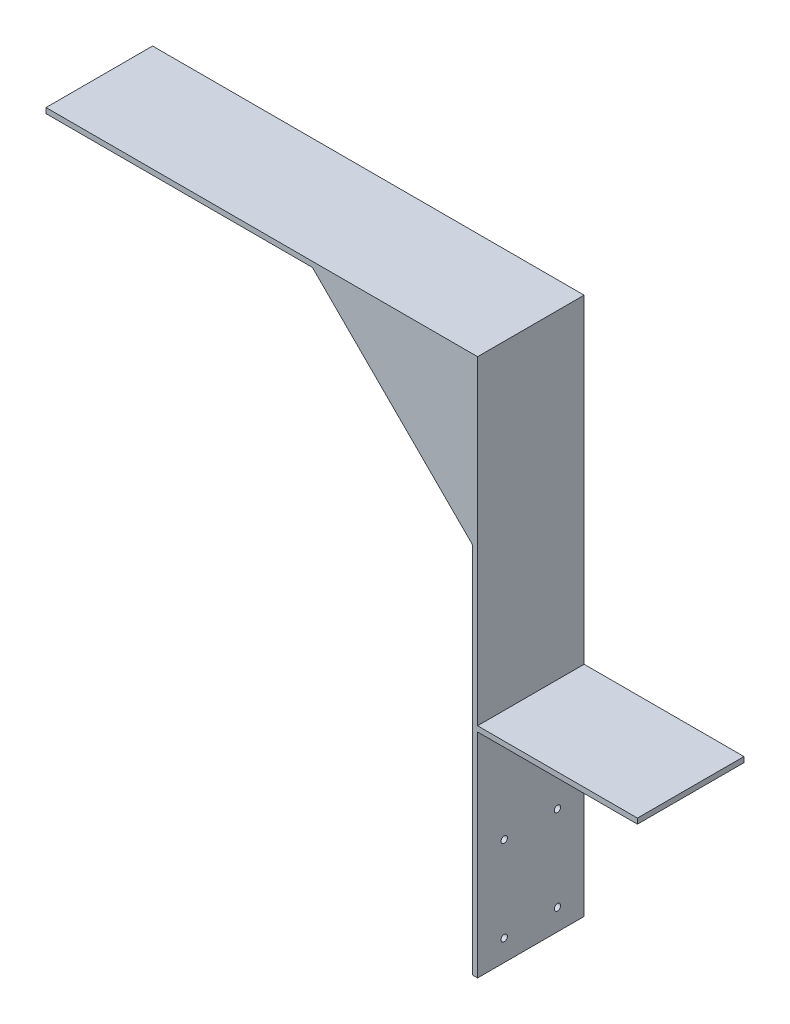
ISO-10303-21;
HEADER;
FILE_DESCRIPTION(('STEP AP214'),'2;1');
FILE_NAME('part.step','',(''),(''),'','','');
FILE_SCHEMA(('AUTOMOTIVE_DESIGN { 1 0 10303 214 1 1 1 1 }'));
ENDSEC;
DATA;
#1=APPLICATION_CONTEXT('core data for automotive mechanical design processes');
#2=APPLICATION_PROTOCOL_DEFINITION('international standard','automotive_design',2000,#1);
#3=PRODUCT_CONTEXT('',#1,'mechanical');
#4=PRODUCT('Part','Part','',(#3));
#5=PRODUCT_RELATED_PRODUCT_CATEGORY('part','',(#4));
#6=PRODUCT_DEFINITION_FORMATION('','',#4);
#7=PRODUCT_DEFINITION_CONTEXT('part definition',#1,'design');
#8=PRODUCT_DEFINITION('design','',#6,#7);
#9=PRODUCT_DEFINITION_SHAPE('','',#8);
#10=(LENGTH_UNIT() NAMED_UNIT(*) SI_UNIT(.MILLI.,.METRE.));
#11=(NAMED_UNIT(*) PLANE_ANGLE_UNIT() SI_UNIT($,.RADIAN.));
#12=(NAMED_UNIT(*) SI_UNIT($,.STERADIAN.) SOLID_ANGLE_UNIT());
#13=UNCERTAINTY_MEASURE_WITH_UNIT(LENGTH_MEASURE(1.E-05),#10,'distance_accuracy_value','');
#14=(GEOMETRIC_REPRESENTATION_CONTEXT(3) GLOBAL_UNCERTAINTY_ASSIGNED_CONTEXT((#13)) GLOBAL_UNIT_ASSIGNED_CONTEXT((#10,
#11,#12)) REPRESENTATION_CONTEXT('',''));
#15=CARTESIAN_POINT('',(0.,0.,0.));
#16=DIRECTION('',(0.,0.,1.));
#17=DIRECTION('',(1.,0.,0.));
#18=AXIS2_PLACEMENT_3D('',#15,#16,#17);
#19=CARTESIAN_POINT('',(5.,0.,100.));
#20=DIRECTION('',(-1.,0.,0.));
#21=DIRECTION('',(0.,0.,1.));
#22=AXIS2_PLACEMENT_3D('',#19,#20,#21);
#23=PLANE('',#22);
#24=DIRECTION('',(0.,0.,1.));
#25=VECTOR('',#24,1.);
#26=CARTESIAN_POINT('',(5.,205.,100.));
#27=LINE('',#26,#25);
#28=CARTESIAN_POINT('',(5.,205.,0.));
#29=VERTEX_POINT('',#28);
#30=CARTESIAN_POINT('',(5.,205.,100.));
#31=VERTEX_POINT('',#30);
#32=EDGE_CURVE('E143',#29,#31,#27,.T.);
#33=ORIENTED_EDGE('',*,*,#32,.F.);
#34=DIRECTION('',(0.,1.,0.));
#35=VECTOR('',#34,1.);
#36=CARTESIAN_POINT('',(5.,0.,0.));
#37=LINE('',#36,#35);
#38=CARTESIAN_POINT('',(5.,505.,0.));
#39=VERTEX_POINT('',#38);
#40=EDGE_CURVE('E211',#29,#39,#37,.T.);
#41=ORIENTED_EDGE('',*,*,#40,.T.);
#42=DIRECTION('',(0.,0.,-1.));
#43=VECTOR('',#42,1.);
#44=CARTESIAN_POINT('',(5.,505.,100.));
#45=LINE('',#44,#43);
#46=CARTESIAN_POINT('',(5.,505.,100.));
#47=VERTEX_POINT('',#46);
#48=EDGE_CURVE('E196',#47,#39,#45,.T.);
#49=ORIENTED_EDGE('',*,*,#48,.F.);
#50=DIRECTION('',(0.,1.,0.));
#51=VECTOR('',#50,1.);
#52=CARTESIAN_POINT('',(5.,0.,100.));
#53=LINE('',#52,#51);
#54=EDGE_CURVE('E194',#31,#47,#53,.T.);
#55=ORIENTED_EDGE('',*,*,#54,.F.);
#56=EDGE_LOOP('',(#33,#41,#49,#55));
#57=FACE_BOUND('',#56,.T.);
#58=ADVANCED_FACE('F34',(#57),#23,.F.);
#59=CARTESIAN_POINT('',(5.,20.,25.));
#60=DIRECTION('',(1.,0.,0.));
#61=DIRECTION('',(0.,0.,-1.));
#62=AXIS2_PLACEMENT_3D('',#59,#60,#61);
#63=CIRCLE('',#62,2.99999999999999);
#64=CARTESIAN_POINT('',(5.,20.,22.));
#65=VERTEX_POINT('',#64);
#66=EDGE_CURVE('E174',#65,#65,#63,.T.);
#67=ORIENTED_EDGE('',*,*,#66,.F.);
#68=EDGE_LOOP('',(#67));
#69=FACE_BOUND('',#68,.T.);
#70=CARTESIAN_POINT('',(5.,20.,75.));
#71=DIRECTION('',(1.,0.,0.));
#72=DIRECTION('',(0.,0.,-1.));
#73=AXIS2_PLACEMENT_3D('',#70,#71,#72);
#74=CIRCLE('',#73,2.99999999999999);
#75=CARTESIAN_POINT('',(5.,20.,72.));
#76=VERTEX_POINT('',#75);
#77=EDGE_CURVE('E168',#76,#76,#74,.T.);
#78=ORIENTED_EDGE('',*,*,#77,.F.);
#79=EDGE_LOOP('',(#78));
#80=FACE_BOUND('',#79,.T.);
#81=CARTESIAN_POINT('',(5.,100.,75.));
#82=DIRECTION('',(1.,0.,0.));
#83=DIRECTION('',(0.,0.,-1.));
#84=AXIS2_PLACEMENT_3D('',#81,#82,#83);
#85=CIRCLE('',#84,2.99999999999999);
#86=CARTESIAN_POINT('',(5.,100.,72.));
#87=VERTEX_POINT('',#86);
#88=EDGE_CURVE('E162',#87,#87,#85,.T.);
#89=ORIENTED_EDGE('',*,*,#88,.F.);
#90=EDGE_LOOP('',(#89));
#91=FACE_BOUND('',#90,.T.);
#92=CARTESIAN_POINT('',(5.,100.,25.));
#93=DIRECTION('',(1.,0.,0.));
#94=DIRECTION('',(0.,0.,-1.));
#95=AXIS2_PLACEMENT_3D('',#92,#93,#94);
#96=CIRCLE('',#95,2.99999999999999);
#97=CARTESIAN_POINT('',(5.,100.,22.));
#98=VERTEX_POINT('',#97);
#99=EDGE_CURVE('E151',#98,#98,#96,.T.);
#100=ORIENTED_EDGE('',*,*,#99,.F.);
#101=EDGE_LOOP('',(#100));
#102=FACE_BOUND('',#101,.T.);
#103=DIRECTION('',(0.,0.,-1.));
#104=VECTOR('',#103,1.);
#105=CARTESIAN_POINT('',(5.,200.,100.));
#106=LINE('',#105,#104);
#107=CARTESIAN_POINT('',(5.,200.,100.));
#108=VERTEX_POINT('',#107);
#109=CARTESIAN_POINT('',(5.,200.,0.));
#110=VERTEX_POINT('',#109);
#111=EDGE_CURVE('E252',#108,#110,#106,.T.);
#112=ORIENTED_EDGE('',*,*,#111,.F.);
#113=CARTESIAN_POINT('',(5.,0.,100.));
#114=VERTEX_POINT('',#113);
#115=EDGE_CURVE('E150',#114,#108,#53,.T.);
#116=ORIENTED_EDGE('',*,*,#115,.F.);
#117=DIRECTION('',(0.,0.,-1.));
#118=VECTOR('',#117,1.);
#119=CARTESIAN_POINT('',(5.,0.,100.));
#120=LINE('',#119,#118);
#121=CARTESIAN_POINT('',(5.,0.,0.));
#122=VERTEX_POINT('',#121);
#123=EDGE_CURVE('E215',#114,#122,#120,.T.);
#124=ORIENTED_EDGE('',*,*,#123,.T.);
#125=EDGE_CURVE('E184',#122,#110,#37,.T.);
#126=ORIENTED_EDGE('',*,*,#125,.T.);
#127=EDGE_LOOP('',(#112,#116,#124,#126));
#128=FACE_BOUND('',#127,.T.);
#129=ADVANCED_FACE('F281',(#69,#80,#91,#102,#128),#23,.F.);
#130=CARTESIAN_POINT('',(0.,505.,100.));
#131=DIRECTION('',(0.,-1.,0.));
#132=DIRECTION('',(1.,0.,0.));
#133=AXIS2_PLACEMENT_3D('',#130,#131,#132);
#134=PLANE('',#133);
#135=DIRECTION('',(-1.,0.,0.));
#136=VECTOR('',#135,1.);
#137=CARTESIAN_POINT('',(0.,505.,0.));
#138=LINE('',#137,#136);
#139=CARTESIAN_POINT('',(-400.,504.999999999999,0.));
#140=VERTEX_POINT('',#139);
#141=EDGE_CURVE('E180',#39,#140,#138,.T.);
#142=ORIENTED_EDGE('',*,*,#141,.T.);
#143=DIRECTION('',(0.,0.,-1.));
#144=VECTOR('',#143,1.);
#145=CARTESIAN_POINT('',(-400.,504.999999999999,100.));
#146=LINE('',#145,#144);
#147=CARTESIAN_POINT('',(-400.,504.999999999999,100.));
#148=VERTEX_POINT('',#147);
#149=EDGE_CURVE('E11',#148,#140,#146,.T.);
#150=ORIENTED_EDGE('',*,*,#149,.F.);
#151=DIRECTION('',(-1.,0.,0.));
#152=VECTOR('',#151,1.);
#153=CARTESIAN_POINT('',(0.,505.,100.));
#154=LINE('',#153,#152);
#155=EDGE_CURVE('E181',#47,#148,#154,.T.);
#156=ORIENTED_EDGE('',*,*,#155,.F.);
#157=ORIENTED_EDGE('',*,*,#48,.T.);
#158=EDGE_LOOP('',(#142,#150,#156,#157));
#159=FACE_BOUND('',#158,.T.);
#160=ADVANCED_FACE('F36',(#159),#134,.F.);
#161=CARTESIAN_POINT('',(-400.,499.999999999999,100.));
#162=DIRECTION('',(-1.,0.,0.));
#163=DIRECTION('',(0.,0.,1.));
#164=AXIS2_PLACEMENT_3D('',#161,#162,#163);
#165=PLANE('',#164);
#166=DIRECTION('',(0.,1.,0.));
#167=VECTOR('',#166,1.);
#168=CARTESIAN_POINT('',(-400.,499.999999999999,0.));
#169=LINE('',#168,#167);
#170=CARTESIAN_POINT('',(-400.,499.999999999999,0.));
#171=VERTEX_POINT('',#170);
#172=EDGE_CURVE('E199',#171,#140,#169,.T.);
#173=ORIENTED_EDGE('',*,*,#172,.F.);
#174=DIRECTION('',(0.,0.,-1.));
#175=VECTOR('',#174,1.);
#176=CARTESIAN_POINT('',(-400.,499.999999999999,100.));
#177=LINE('',#176,#175);
#178=CARTESIAN_POINT('',(-400.,499.999999999999,100.));
#179=VERTEX_POINT('',#178);
#180=EDGE_CURVE('E42',#179,#171,#177,.T.);
#181=ORIENTED_EDGE('',*,*,#180,.F.);
#182=DIRECTION('',(0.,1.,0.));
#183=VECTOR('',#182,1.);
#184=CARTESIAN_POINT('',(-400.,499.999999999999,100.));
#185=LINE('',#184,#183);
#186=EDGE_CURVE('E183',#179,#148,#185,.T.);
#187=ORIENTED_EDGE('',*,*,#186,.T.);
#188=ORIENTED_EDGE('',*,*,#149,.T.);
#189=EDGE_LOOP('',(#173,#181,#187,#188));
#190=FACE_BOUND('',#189,.T.);
#191=ADVANCED_FACE('F226',(#190),#165,.T.);
#192=CARTESIAN_POINT('',(0.,500.,100.));
#193=DIRECTION('',(0.,-1.,0.));
#194=DIRECTION('',(1.,0.,0.));
#195=AXIS2_PLACEMENT_3D('',#192,#193,#194);
#196=PLANE('',#195);
#197=DIRECTION('',(0.,0.,1.));
#198=VECTOR('',#197,1.);
#199=CARTESIAN_POINT('',(-150.,500.,95.));
#200=LINE('',#199,#198);
#201=CARTESIAN_POINT('',(-150.,499.999999999999,95.));
#202=VERTEX_POINT('',#201);
#203=CARTESIAN_POINT('',(-150.,499.999999999999,100.));
#204=VERTEX_POINT('',#203);
#205=EDGE_CURVE('E249',#202,#204,#200,.T.);
#206=ORIENTED_EDGE('',*,*,#205,.T.);
#207=DIRECTION('',(-1.,0.,0.));
#208=VECTOR('',#207,1.);
#209=CARTESIAN_POINT('',(0.,500.,100.));
#210=LINE('',#209,#208);
#211=EDGE_CURVE('E187',#204,#179,#210,.T.);
#212=ORIENTED_EDGE('',*,*,#211,.T.);
#213=ORIENTED_EDGE('',*,*,#180,.T.);
#214=DIRECTION('',(-1.,0.,0.));
#215=VECTOR('',#214,1.);
#216=CARTESIAN_POINT('',(0.,500.,0.));
#217=LINE('',#216,#215);
#218=CARTESIAN_POINT('',(0.,500.,0.));
#219=VERTEX_POINT('',#218);
#220=EDGE_CURVE('E202',#219,#171,#217,.T.);
#221=ORIENTED_EDGE('',*,*,#220,.F.);
#222=DIRECTION('',(0.,0.,-1.));
#223=VECTOR('',#222,1.);
#224=CARTESIAN_POINT('',(0.,500.,100.));
#225=LINE('',#224,#223);
#226=CARTESIAN_POINT('',(0.,500.,95.));
#227=VERTEX_POINT('',#226);
#228=EDGE_CURVE('E219',#227,#219,#225,.T.);
#229=ORIENTED_EDGE('',*,*,#228,.F.);
#230=DIRECTION('',(-1.,0.,0.));
#231=VECTOR('',#230,1.);
#232=CARTESIAN_POINT('',(0.,500.,95.));
#233=LINE('',#232,#231);
#234=EDGE_CURVE('E49',#227,#202,#233,.T.);
#235=ORIENTED_EDGE('',*,*,#234,.T.);
#236=EDGE_LOOP('',(#206,#212,#213,#221,#229,#235));
#237=FACE_BOUND('',#236,.T.);
#238=ADVANCED_FACE('F223',(#237),#196,.T.);
#239=CARTESIAN_POINT('',(0.,0.,100.));
#240=DIRECTION('',(-1.,0.,0.));
#241=DIRECTION('',(0.,0.,1.));
#242=AXIS2_PLACEMENT_3D('',#239,#240,#241);
#243=PLANE('',#242);
#244=DIRECTION('',(0.,0.,1.));
#245=VECTOR('',#244,1.);
#246=CARTESIAN_POINT('',(0.,350.,95.));
#247=LINE('',#246,#245);
#248=CARTESIAN_POINT('',(0.,350.,95.));
#249=VERTEX_POINT('',#248);
#250=CARTESIAN_POINT('',(0.,350.,100.));
#251=VERTEX_POINT('',#250);
#252=EDGE_CURVE('E57',#249,#251,#247,.T.);
#253=ORIENTED_EDGE('',*,*,#252,.F.);
#254=DIRECTION('',(0.,1.,0.));
#255=VECTOR('',#254,1.);
#256=CARTESIAN_POINT('',(0.,350.,95.));
#257=LINE('',#256,#255);
#258=EDGE_CURVE('E238',#249,#227,#257,.T.);
#259=ORIENTED_EDGE('',*,*,#258,.T.);
#260=ORIENTED_EDGE('',*,*,#228,.T.);
#261=DIRECTION('',(0.,1.,0.));
#262=VECTOR('',#261,1.);
#263=CARTESIAN_POINT('',(0.,0.,0.));
#264=LINE('',#263,#262);
#265=CARTESIAN_POINT('',(0.,0.,0.));
#266=VERTEX_POINT('',#265);
#267=EDGE_CURVE('E205',#266,#219,#264,.T.);
#268=ORIENTED_EDGE('',*,*,#267,.F.);
#269=DIRECTION('',(0.,0.,-1.));
#270=VECTOR('',#269,1.);
#271=CARTESIAN_POINT('',(0.,0.,100.));
#272=LINE('',#271,#270);
#273=CARTESIAN_POINT('',(0.,0.,100.));
#274=VERTEX_POINT('',#273);
#275=EDGE_CURVE('E217',#274,#266,#272,.T.);
#276=ORIENTED_EDGE('',*,*,#275,.F.);
#277=DIRECTION('',(0.,1.,0.));
#278=VECTOR('',#277,1.);
#279=CARTESIAN_POINT('',(0.,0.,100.));
#280=LINE('',#279,#278);
#281=EDGE_CURVE('E189',#274,#251,#280,.T.);
#282=ORIENTED_EDGE('',*,*,#281,.T.);
#283=EDGE_LOOP('',(#253,#259,#260,#268,#276,#282));
#284=FACE_BOUND('',#283,.T.);
#285=CARTESIAN_POINT('',(0.,100.,25.));
#286=DIRECTION('',(-1.,0.,0.));
#287=DIRECTION('',(0.,0.,1.));
#288=AXIS2_PLACEMENT_3D('',#285,#286,#287);
#289=CIRCLE('',#288,2.99999999999995);
#290=CARTESIAN_POINT('',(0.,100.,28.));
#291=VERTEX_POINT('',#290);
#292=EDGE_CURVE('E154',#291,#291,#289,.T.);
#293=ORIENTED_EDGE('',*,*,#292,.F.);
#294=EDGE_LOOP('',(#293));
#295=FACE_BOUND('',#294,.T.);
#296=CARTESIAN_POINT('',(0.,100.,75.));
#297=DIRECTION('',(-1.,0.,0.));
#298=DIRECTION('',(0.,0.,1.));
#299=AXIS2_PLACEMENT_3D('',#296,#297,#298);
#300=CIRCLE('',#299,2.99999999999995);
#301=CARTESIAN_POINT('',(0.,100.,78.));
#302=VERTEX_POINT('',#301);
#303=EDGE_CURVE('E165',#302,#302,#300,.T.);
#304=ORIENTED_EDGE('',*,*,#303,.F.);
#305=EDGE_LOOP('',(#304));
#306=FACE_BOUND('',#305,.T.);
#307=CARTESIAN_POINT('',(0.,20.,75.));
#308=DIRECTION('',(-1.,0.,0.));
#309=DIRECTION('',(0.,0.,1.));
#310=AXIS2_PLACEMENT_3D('',#307,#308,#309);
#311=CIRCLE('',#310,2.99999999999995);
#312=CARTESIAN_POINT('',(0.,20.,78.));
#313=VERTEX_POINT('',#312);
#314=EDGE_CURVE('E171',#313,#313,#311,.T.);
#315=ORIENTED_EDGE('',*,*,#314,.F.);
#316=EDGE_LOOP('',(#315));
#317=FACE_BOUND('',#316,.T.);
#318=CARTESIAN_POINT('',(0.,20.,25.));
#319=DIRECTION('',(-1.,0.,0.));
#320=DIRECTION('',(0.,0.,1.));
#321=AXIS2_PLACEMENT_3D('',#318,#319,#320);
#322=CIRCLE('',#321,2.99999999999995);
#323=CARTESIAN_POINT('',(0.,20.,28.));
#324=VERTEX_POINT('',#323);
#325=EDGE_CURVE('E177',#324,#324,#322,.T.);
#326=ORIENTED_EDGE('',*,*,#325,.F.);
#327=EDGE_LOOP('',(#326));
#328=FACE_BOUND('',#327,.T.);
#329=ADVANCED_FACE('F234',(#284,#295,#306,#317,#328),#243,.T.);
#330=CARTESIAN_POINT('',(5.,0.,100.));
#331=DIRECTION('',(0.,-1.,0.));
#332=DIRECTION('',(0.,0.,-1.));
#333=AXIS2_PLACEMENT_3D('',#330,#331,#332);
#334=PLANE('',#333);
#335=DIRECTION('',(-1.,0.,0.));
#336=VECTOR('',#335,1.);
#337=CARTESIAN_POINT('',(5.,0.,0.));
#338=LINE('',#337,#336);
#339=EDGE_CURVE('E208',#122,#266,#338,.T.);
#340=ORIENTED_EDGE('',*,*,#339,.F.);
#341=ORIENTED_EDGE('',*,*,#123,.F.);
#342=DIRECTION('',(-1.,0.,0.));
#343=VECTOR('',#342,1.);
#344=CARTESIAN_POINT('',(5.,0.,100.));
#345=LINE('',#344,#343);
#346=EDGE_CURVE('E191',#114,#274,#345,.T.);
#347=ORIENTED_EDGE('',*,*,#346,.T.);
#348=ORIENTED_EDGE('',*,*,#275,.T.);
#349=EDGE_LOOP('',(#340,#341,#347,#348));
#350=FACE_BOUND('',#349,.T.);
#351=ADVANCED_FACE('F290',(#350),#334,.T.);
#352=CARTESIAN_POINT('',(0.,0.,100.));
#353=DIRECTION('',(0.,0.,-1.));
#354=DIRECTION('',(-1.,0.,0.));
#355=AXIS2_PLACEMENT_3D('',#352,#353,#354);
#356=PLANE('',#355);
#357=ORIENTED_EDGE('',*,*,#211,.F.);
#358=DIRECTION('',(0.707106781186547,-0.707106781186548,0.));
#359=VECTOR('',#358,1.);
#360=CARTESIAN_POINT('',(-150.,500.,100.));
#361=LINE('',#360,#359);
#362=EDGE_CURVE('E243',#204,#251,#361,.T.);
#363=ORIENTED_EDGE('',*,*,#362,.T.);
#364=ORIENTED_EDGE('',*,*,#281,.F.);
#365=ORIENTED_EDGE('',*,*,#346,.F.);
#366=ORIENTED_EDGE('',*,*,#115,.T.);
#367=DIRECTION('',(-1.,0.,0.));
#368=VECTOR('',#367,1.);
#369=CARTESIAN_POINT('',(155.,200.,100.));
#370=LINE('',#369,#368);
#371=CARTESIAN_POINT('',(155.,200.,100.));
#372=VERTEX_POINT('',#371);
#373=EDGE_CURVE('E128',#372,#108,#370,.T.);
#374=ORIENTED_EDGE('',*,*,#373,.F.);
#375=DIRECTION('',(0.,-1.,0.));
#376=VECTOR('',#375,1.);
#377=CARTESIAN_POINT('',(155.,205.,100.));
#378=LINE('',#377,#376);
#379=CARTESIAN_POINT('',(155.,205.,100.));
#380=VERTEX_POINT('',#379);
#381=EDGE_CURVE('E134',#380,#372,#378,.T.);
#382=ORIENTED_EDGE('',*,*,#381,.F.);
#383=DIRECTION('',(-1.,0.,0.));
#384=VECTOR('',#383,1.);
#385=CARTESIAN_POINT('',(155.,205.,100.));
#386=LINE('',#385,#384);
#387=EDGE_CURVE('E256',#380,#31,#386,.T.);
#388=ORIENTED_EDGE('',*,*,#387,.T.);
#389=ORIENTED_EDGE('',*,*,#54,.T.);
#390=ORIENTED_EDGE('',*,*,#155,.T.);
#391=ORIENTED_EDGE('',*,*,#186,.F.);
#392=EDGE_LOOP('',(#357,#363,#364,#365,#366,#374,#382,#388,#389,#390,#391));
#393=FACE_BOUND('',#392,.T.);
#394=ADVANCED_FACE('F147',(#393),#356,.F.);
#395=CARTESIAN_POINT('',(0.,0.,0.));
#396=DIRECTION('',(0.,0.,-1.));
#397=DIRECTION('',(-1.,0.,0.));
#398=AXIS2_PLACEMENT_3D('',#395,#396,#397);
#399=PLANE('',#398);
#400=ORIENTED_EDGE('',*,*,#141,.F.);
#401=ORIENTED_EDGE('',*,*,#40,.F.);
#402=DIRECTION('',(-1.,0.,0.));
#403=VECTOR('',#402,1.);
#404=CARTESIAN_POINT('',(155.,205.,0.));
#405=LINE('',#404,#403);
#406=CARTESIAN_POINT('',(155.,205.,0.));
#407=VERTEX_POINT('',#406);
#408=EDGE_CURVE('E156',#407,#29,#405,.T.);
#409=ORIENTED_EDGE('',*,*,#408,.F.);
#410=DIRECTION('',(0.,1.,0.));
#411=VECTOR('',#410,1.);
#412=CARTESIAN_POINT('',(155.,205.,0.));
#413=LINE('',#412,#411);
#414=CARTESIAN_POINT('',(155.,200.,0.));
#415=VERTEX_POINT('',#414);
#416=EDGE_CURVE('E133',#415,#407,#413,.T.);
#417=ORIENTED_EDGE('',*,*,#416,.F.);
#418=DIRECTION('',(-1.,0.,0.));
#419=VECTOR('',#418,1.);
#420=CARTESIAN_POINT('',(155.,200.,0.));
#421=LINE('',#420,#419);
#422=EDGE_CURVE('E130',#415,#110,#421,.T.);
#423=ORIENTED_EDGE('',*,*,#422,.T.);
#424=ORIENTED_EDGE('',*,*,#125,.F.);
#425=ORIENTED_EDGE('',*,*,#339,.T.);
#426=ORIENTED_EDGE('',*,*,#267,.T.);
#427=ORIENTED_EDGE('',*,*,#220,.T.);
#428=ORIENTED_EDGE('',*,*,#172,.T.);
#429=EDGE_LOOP('',(#400,#401,#409,#417,#423,#424,#425,#426,#427,#428));
#430=FACE_BOUND('',#429,.T.);
#431=ADVANCED_FACE('F230',(#430),#399,.T.);
#432=CARTESIAN_POINT('',(5.,20.,25.));
#433=DIRECTION('',(1.,0.,0.));
#434=DIRECTION('',(0.,0.,-1.));
#435=AXIS2_PLACEMENT_3D('',#432,#433,#434);
#436=CYLINDRICAL_SURFACE('',#435,2.99999999999995);
#437=ORIENTED_EDGE('',*,*,#325,.T.);
#438=EDGE_LOOP('',(#437));
#439=FACE_BOUND('',#438,.T.);
#440=ORIENTED_EDGE('',*,*,#66,.T.);
#441=EDGE_LOOP('',(#440));
#442=FACE_BOUND('',#441,.T.);
#443=ADVANCED_FACE('F320',(#439,#442),#436,.F.);
#444=CARTESIAN_POINT('',(5.,20.,75.));
#445=DIRECTION('',(1.,0.,0.));
#446=DIRECTION('',(0.,0.,-1.));
#447=AXIS2_PLACEMENT_3D('',#444,#445,#446);
#448=CYLINDRICAL_SURFACE('',#447,2.99999999999995);
#449=ORIENTED_EDGE('',*,*,#314,.T.);
#450=EDGE_LOOP('',(#449));
#451=FACE_BOUND('',#450,.T.);
#452=ORIENTED_EDGE('',*,*,#77,.T.);
#453=EDGE_LOOP('',(#452));
#454=FACE_BOUND('',#453,.T.);
#455=ADVANCED_FACE('F392',(#451,#454),#448,.F.);
#456=CARTESIAN_POINT('',(5.,100.,75.));
#457=DIRECTION('',(1.,0.,0.));
#458=DIRECTION('',(0.,0.,-1.));
#459=AXIS2_PLACEMENT_3D('',#456,#457,#458);
#460=CYLINDRICAL_SURFACE('',#459,2.99999999999995);
#461=ORIENTED_EDGE('',*,*,#303,.T.);
#462=EDGE_LOOP('',(#461));
#463=FACE_BOUND('',#462,.T.);
#464=ORIENTED_EDGE('',*,*,#88,.T.);
#465=EDGE_LOOP('',(#464));
#466=FACE_BOUND('',#465,.T.);
#467=ADVANCED_FACE('F402',(#463,#466),#460,.F.);
#468=CARTESIAN_POINT('',(5.,100.,25.));
#469=DIRECTION('',(1.,0.,0.));
#470=DIRECTION('',(0.,0.,-1.));
#471=AXIS2_PLACEMENT_3D('',#468,#469,#470);
#472=CYLINDRICAL_SURFACE('',#471,2.99999999999995);
#473=ORIENTED_EDGE('',*,*,#292,.T.);
#474=EDGE_LOOP('',(#473));
#475=FACE_BOUND('',#474,.T.);
#476=ORIENTED_EDGE('',*,*,#99,.T.);
#477=EDGE_LOOP('',(#476));
#478=FACE_BOUND('',#477,.T.);
#479=ADVANCED_FACE('F332',(#475,#478),#472,.F.);
#480=CARTESIAN_POINT('',(155.,200.,100.));
#481=DIRECTION('',(0.,1.,0.));
#482=DIRECTION('',(0.,0.,1.));
#483=AXIS2_PLACEMENT_3D('',#480,#481,#482);
#484=PLANE('',#483);
#485=ORIENTED_EDGE('',*,*,#111,.T.);
#486=ORIENTED_EDGE('',*,*,#422,.F.);
#487=DIRECTION('',(0.,0.,-1.));
#488=VECTOR('',#487,1.);
#489=CARTESIAN_POINT('',(155.,200.,100.));
#490=LINE('',#489,#488);
#491=EDGE_CURVE('E123',#372,#415,#490,.T.);
#492=ORIENTED_EDGE('',*,*,#491,.F.);
#493=ORIENTED_EDGE('',*,*,#373,.T.);
#494=EDGE_LOOP('',(#485,#486,#492,#493));
#495=FACE_BOUND('',#494,.T.);
#496=ADVANCED_FACE('F126',(#495),#484,.F.);
#497=CARTESIAN_POINT('',(155.,205.,100.));
#498=DIRECTION('',(0.,-1.,0.));
#499=DIRECTION('',(0.,0.,-1.));
#500=AXIS2_PLACEMENT_3D('',#497,#498,#499);
#501=PLANE('',#500);
#502=ORIENTED_EDGE('',*,*,#32,.T.);
#503=ORIENTED_EDGE('',*,*,#387,.F.);
#504=DIRECTION('',(0.,0.,1.));
#505=VECTOR('',#504,1.);
#506=CARTESIAN_POINT('',(155.,205.,100.));
#507=LINE('',#506,#505);
#508=EDGE_CURVE('E139',#407,#380,#507,.T.);
#509=ORIENTED_EDGE('',*,*,#508,.F.);
#510=ORIENTED_EDGE('',*,*,#408,.T.);
#511=EDGE_LOOP('',(#502,#503,#509,#510));
#512=FACE_BOUND('',#511,.T.);
#513=ADVANCED_FACE('F263',(#512),#501,.F.);
#514=CARTESIAN_POINT('',(155.,0.,0.));
#515=DIRECTION('',(1.,0.,0.));
#516=DIRECTION('',(0.,0.,-1.));
#517=AXIS2_PLACEMENT_3D('',#514,#515,#516);
#518=PLANE('',#517);
#519=ORIENTED_EDGE('',*,*,#381,.T.);
#520=ORIENTED_EDGE('',*,*,#491,.T.);
#521=ORIENTED_EDGE('',*,*,#416,.T.);
#522=ORIENTED_EDGE('',*,*,#508,.T.);
#523=EDGE_LOOP('',(#519,#520,#521,#522));
#524=FACE_BOUND('',#523,.T.);
#525=ADVANCED_FACE('F137',(#524),#518,.T.);
#526=CARTESIAN_POINT('',(-150.,500.,95.));
#527=DIRECTION('',(-0.707106781186548,-0.707106781186547,0.));
#528=DIRECTION('',(0.707106781186547,-0.707106781186548,0.));
#529=AXIS2_PLACEMENT_3D('',#526,#527,#528);
#530=PLANE('',#529);
#531=ORIENTED_EDGE('',*,*,#362,.F.);
#532=ORIENTED_EDGE('',*,*,#205,.F.);
#533=DIRECTION('',(0.707106781186547,-0.707106781186548,0.));
#534=VECTOR('',#533,1.);
#535=CARTESIAN_POINT('',(-150.,500.,95.));
#536=LINE('',#535,#534);
#537=EDGE_CURVE('E242',#202,#249,#536,.T.);
#538=ORIENTED_EDGE('',*,*,#537,.T.);
#539=ORIENTED_EDGE('',*,*,#252,.T.);
#540=EDGE_LOOP('',(#531,#532,#538,#539));
#541=FACE_BOUND('',#540,.T.);
#542=ADVANCED_FACE('F271',(#541),#530,.T.);
#543=CARTESIAN_POINT('',(0.,0.,95.));
#544=DIRECTION('',(0.,0.,-1.));
#545=DIRECTION('',(-1.,0.,0.));
#546=AXIS2_PLACEMENT_3D('',#543,#544,#545);
#547=PLANE('',#546);
#548=ORIENTED_EDGE('',*,*,#234,.F.);
#549=ORIENTED_EDGE('',*,*,#258,.F.);
#550=ORIENTED_EDGE('',*,*,#537,.F.);
#551=EDGE_LOOP('',(#548,#549,#550));
#552=FACE_BOUND('',#551,.T.);
#553=ADVANCED_FACE('F241',(#552),#547,.T.);
#554=CLOSED_SHELL('',(#58,#129,#160,#191,#238,#329,#351,#394,#431,#443,#455,#467,#479,#496,#513,
#525,#542,#553));
#555=MANIFOLD_SOLID_BREP('B2',#554);
#556=ADVANCED_BREP_SHAPE_REPRESENTATION('',(#18,#555),#14);
#557=SHAPE_DEFINITION_REPRESENTATION(#9,#556);
ENDSEC;
END-ISO-10303-21;
